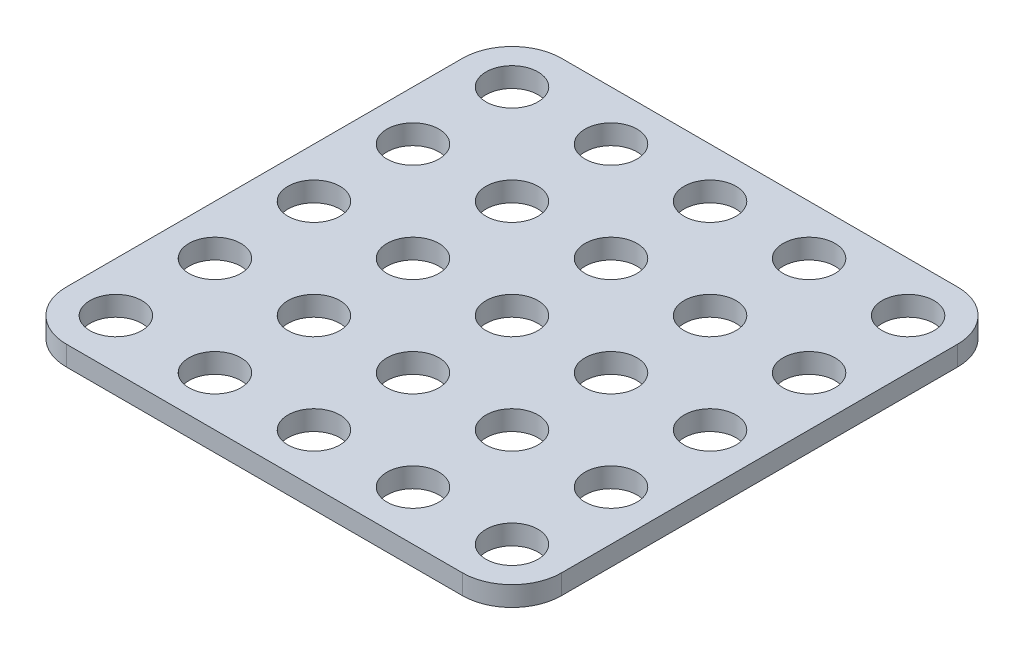
ISO-10303-21;
HEADER;
FILE_DESCRIPTION(('STEP AP214'),'2;1');
FILE_NAME('part.step','',(''),(''),'','','');
FILE_SCHEMA(('AUTOMOTIVE_DESIGN { 1 0 10303 214 1 1 1 1 }'));
ENDSEC;
DATA;
#1=APPLICATION_CONTEXT('core data for automotive mechanical design processes');
#2=APPLICATION_PROTOCOL_DEFINITION('international standard','automotive_design',2000,#1);
#3=PRODUCT_CONTEXT('',#1,'mechanical');
#4=PRODUCT('Part','Part','',(#3));
#5=PRODUCT_RELATED_PRODUCT_CATEGORY('part','',(#4));
#6=PRODUCT_DEFINITION_FORMATION('','',#4);
#7=PRODUCT_DEFINITION_CONTEXT('part definition',#1,'design');
#8=PRODUCT_DEFINITION('design','',#6,#7);
#9=PRODUCT_DEFINITION_SHAPE('','',#8);
#10=(LENGTH_UNIT() NAMED_UNIT(*) SI_UNIT(.MILLI.,.METRE.));
#11=(NAMED_UNIT(*) PLANE_ANGLE_UNIT() SI_UNIT($,.RADIAN.));
#12=(NAMED_UNIT(*) SI_UNIT($,.STERADIAN.) SOLID_ANGLE_UNIT());
#13=UNCERTAINTY_MEASURE_WITH_UNIT(LENGTH_MEASURE(1.E-05),#10,'distance_accuracy_value','');
#14=(GEOMETRIC_REPRESENTATION_CONTEXT(3) GLOBAL_UNCERTAINTY_ASSIGNED_CONTEXT((#13)) GLOBAL_UNIT_ASSIGNED_CONTEXT((#10,
#11,#12)) REPRESENTATION_CONTEXT('',''));
#15=CARTESIAN_POINT('',(0.,0.,0.));
#16=DIRECTION('',(0.,0.,1.));
#17=DIRECTION('',(1.,0.,0.));
#18=AXIS2_PLACEMENT_3D('',#15,#16,#17);
#19=CARTESIAN_POINT('',(0.,-1.6,-41.6));
#20=DIRECTION('',(0.,1.,0.));
#21=DIRECTION('',(0.,0.,1.));
#22=AXIS2_PLACEMENT_3D('',#19,#20,#21);
#23=PLANE('',#22);
#24=CARTESIAN_POINT('',(-28.8,-1.6,-4.8));
#25=DIRECTION('',(0.,1.,0.));
#26=DIRECTION('',(0.,0.,1.));
#27=AXIS2_PLACEMENT_3D('',#24,#25,#26);
#28=CIRCLE('',#27,2.09999999999999);
#29=CARTESIAN_POINT('',(-28.8,-1.6,-2.70000000000001));
#30=VERTEX_POINT('',#29);
#31=EDGE_CURVE('E111',#30,#30,#28,.T.);
#32=ORIENTED_EDGE('',*,*,#31,.T.);
#33=EDGE_LOOP('',(#32));
#34=FACE_BOUND('',#33,.T.);
#35=CARTESIAN_POINT('',(-36.8,-1.6,-4.79999999999999));
#36=DIRECTION('',(0.,1.,0.));
#37=DIRECTION('',(0.,0.,1.));
#38=AXIS2_PLACEMENT_3D('',#35,#36,#37);
#39=CIRCLE('',#38,2.09999999999999);
#40=CARTESIAN_POINT('',(-36.8,-1.6,-2.7));
#41=VERTEX_POINT('',#40);
#42=EDGE_CURVE('E214',#41,#41,#39,.T.);
#43=ORIENTED_EDGE('',*,*,#42,.T.);
#44=EDGE_LOOP('',(#43));
#45=FACE_BOUND('',#44,.T.);
#46=DIRECTION('',(1.,0.,0.));
#47=VECTOR('',#46,1.);
#48=CARTESIAN_POINT('',(-41.6,-1.6,-40.8));
#49=LINE('',#48,#47);
#50=CARTESIAN_POINT('',(-36.8,-1.6,-40.8));
#51=VERTEX_POINT('',#50);
#52=CARTESIAN_POINT('',(-4.8,-1.6,-40.8));
#53=VERTEX_POINT('',#52);
#54=EDGE_CURVE('E82',#51,#53,#49,.T.);
#55=ORIENTED_EDGE('',*,*,#54,.T.);
#56=CARTESIAN_POINT('',(-4.8,-1.6,-36.8));
#57=DIRECTION('',(0.,1.,0.));
#58=DIRECTION('',(0.,0.,1.));
#59=AXIS2_PLACEMENT_3D('',#56,#57,#58);
#60=CIRCLE('',#59,4.);
#61=CARTESIAN_POINT('',(-0.800000000000001,-1.6,-36.8));
#62=VERTEX_POINT('',#61);
#63=EDGE_CURVE('E85',#62,#53,#60,.T.);
#64=ORIENTED_EDGE('',*,*,#63,.F.);
#65=DIRECTION('',(0.,0.,1.));
#66=VECTOR('',#65,1.);
#67=CARTESIAN_POINT('',(-0.8,-1.6,-40.8));
#68=LINE('',#67,#66);
#69=CARTESIAN_POINT('',(-0.799999999999994,-1.6,-4.80000000000001));
#70=VERTEX_POINT('',#69);
#71=EDGE_CURVE('E77',#62,#70,#68,.T.);
#72=ORIENTED_EDGE('',*,*,#71,.T.);
#73=CARTESIAN_POINT('',(-4.79999999999999,-1.6,-4.80000000000001));
#74=DIRECTION('',(0.,1.,0.));
#75=DIRECTION('',(0.,0.,1.));
#76=AXIS2_PLACEMENT_3D('',#73,#74,#75);
#77=CIRCLE('',#76,4.);
#78=CARTESIAN_POINT('',(-4.79999999999999,-1.6,-0.800000000000005));
#79=VERTEX_POINT('',#78);
#80=EDGE_CURVE('E205',#79,#70,#77,.T.);
#81=ORIENTED_EDGE('',*,*,#80,.F.);
#82=DIRECTION('',(-1.,0.,0.));
#83=VECTOR('',#82,1.);
#84=CARTESIAN_POINT('',(-41.6,-1.6,-0.8));
#85=LINE('',#84,#83);
#86=CARTESIAN_POINT('',(-36.8,-1.6,-0.8));
#87=VERTEX_POINT('',#86);
#88=EDGE_CURVE('E112',#79,#87,#85,.T.);
#89=ORIENTED_EDGE('',*,*,#88,.T.);
#90=CARTESIAN_POINT('',(-36.8,-1.6,-4.8));
#91=DIRECTION('',(0.,-1.,0.));
#92=DIRECTION('',(0.,0.,-1.));
#93=AXIS2_PLACEMENT_3D('',#90,#91,#92);
#94=CIRCLE('',#93,4.);
#95=CARTESIAN_POINT('',(-40.8,-1.6,-4.8));
#96=VERTEX_POINT('',#95);
#97=EDGE_CURVE('E208',#96,#87,#94,.F.);
#98=ORIENTED_EDGE('',*,*,#97,.F.);
#99=DIRECTION('',(0.,0.,-1.));
#100=VECTOR('',#99,1.);
#101=CARTESIAN_POINT('',(-40.8,-1.6,-40.8));
#102=LINE('',#101,#100);
#103=CARTESIAN_POINT('',(-40.8,-1.6,-36.8));
#104=VERTEX_POINT('',#103);
#105=EDGE_CURVE('E116',#96,#104,#102,.T.);
#106=ORIENTED_EDGE('',*,*,#105,.T.);
#107=CARTESIAN_POINT('',(-36.8,-1.6,-36.8));
#108=DIRECTION('',(0.,1.,0.));
#109=DIRECTION('',(0.,0.,1.));
#110=AXIS2_PLACEMENT_3D('',#107,#108,#109);
#111=CIRCLE('',#110,4.);
#112=EDGE_CURVE('E88',#51,#104,#111,.T.);
#113=ORIENTED_EDGE('',*,*,#112,.F.);
#114=EDGE_LOOP('',(#55,#64,#72,#81,#89,#98,#106,#113));
#115=FACE_BOUND('',#114,.T.);
#116=CARTESIAN_POINT('',(-20.8,-1.6,-4.8));
#117=DIRECTION('',(0.,1.,0.));
#118=DIRECTION('',(0.,0.,1.));
#119=AXIS2_PLACEMENT_3D('',#116,#117,#118);
#120=CIRCLE('',#119,2.09999999999999);
#121=CARTESIAN_POINT('',(-20.8,-1.6,-2.70000000000001));
#122=VERTEX_POINT('',#121);
#123=EDGE_CURVE('E217',#122,#122,#120,.T.);
#124=ORIENTED_EDGE('',*,*,#123,.T.);
#125=EDGE_LOOP('',(#124));
#126=FACE_BOUND('',#125,.T.);
#127=CARTESIAN_POINT('',(-12.8,-1.6,-4.8));
#128=DIRECTION('',(0.,1.,0.));
#129=DIRECTION('',(0.,0.,1.));
#130=AXIS2_PLACEMENT_3D('',#127,#128,#129);
#131=CIRCLE('',#130,2.09999999999999);
#132=CARTESIAN_POINT('',(-12.8,-1.6,-2.70000000000001));
#133=VERTEX_POINT('',#132);
#134=EDGE_CURVE('E220',#133,#133,#131,.T.);
#135=ORIENTED_EDGE('',*,*,#134,.T.);
#136=EDGE_LOOP('',(#135));
#137=FACE_BOUND('',#136,.T.);
#138=CARTESIAN_POINT('',(-4.8,-1.6,-4.8));
#139=DIRECTION('',(0.,1.,0.));
#140=DIRECTION('',(0.,0.,1.));
#141=AXIS2_PLACEMENT_3D('',#138,#139,#140);
#142=CIRCLE('',#141,2.09999999999999);
#143=CARTESIAN_POINT('',(-4.8,-1.6,-2.70000000000001));
#144=VERTEX_POINT('',#143);
#145=EDGE_CURVE('E223',#144,#144,#142,.T.);
#146=ORIENTED_EDGE('',*,*,#145,.T.);
#147=EDGE_LOOP('',(#146));
#148=FACE_BOUND('',#147,.T.);
#149=CARTESIAN_POINT('',(-36.8,-1.6,-12.8));
#150=DIRECTION('',(0.,1.,0.));
#151=DIRECTION('',(0.,0.,1.));
#152=AXIS2_PLACEMENT_3D('',#149,#150,#151);
#153=CIRCLE('',#152,2.09999999999999);
#154=CARTESIAN_POINT('',(-36.8,-1.6,-10.7));
#155=VERTEX_POINT('',#154);
#156=EDGE_CURVE('E226',#155,#155,#153,.T.);
#157=ORIENTED_EDGE('',*,*,#156,.T.);
#158=EDGE_LOOP('',(#157));
#159=FACE_BOUND('',#158,.T.);
#160=CARTESIAN_POINT('',(-28.8,-1.6,-12.8));
#161=DIRECTION('',(0.,1.,0.));
#162=DIRECTION('',(0.,0.,1.));
#163=AXIS2_PLACEMENT_3D('',#160,#161,#162);
#164=CIRCLE('',#163,2.09999999999999);
#165=CARTESIAN_POINT('',(-28.8,-1.6,-10.7));
#166=VERTEX_POINT('',#165);
#167=EDGE_CURVE('E229',#166,#166,#164,.T.);
#168=ORIENTED_EDGE('',*,*,#167,.T.);
#169=EDGE_LOOP('',(#168));
#170=FACE_BOUND('',#169,.T.);
#171=CARTESIAN_POINT('',(-20.8,-1.6,-12.8));
#172=DIRECTION('',(0.,1.,0.));
#173=DIRECTION('',(0.,0.,1.));
#174=AXIS2_PLACEMENT_3D('',#171,#172,#173);
#175=CIRCLE('',#174,2.09999999999999);
#176=CARTESIAN_POINT('',(-20.8,-1.6,-10.7));
#177=VERTEX_POINT('',#176);
#178=EDGE_CURVE('E232',#177,#177,#175,.T.);
#179=ORIENTED_EDGE('',*,*,#178,.T.);
#180=EDGE_LOOP('',(#179));
#181=FACE_BOUND('',#180,.T.);
#182=CARTESIAN_POINT('',(-12.8,-1.6,-12.8));
#183=DIRECTION('',(0.,1.,0.));
#184=DIRECTION('',(0.,0.,1.));
#185=AXIS2_PLACEMENT_3D('',#182,#183,#184);
#186=CIRCLE('',#185,2.09999999999999);
#187=CARTESIAN_POINT('',(-12.8,-1.6,-10.7));
#188=VERTEX_POINT('',#187);
#189=EDGE_CURVE('E235',#188,#188,#186,.T.);
#190=ORIENTED_EDGE('',*,*,#189,.T.);
#191=EDGE_LOOP('',(#190));
#192=FACE_BOUND('',#191,.T.);
#193=CARTESIAN_POINT('',(-4.8,-1.6,-12.8));
#194=DIRECTION('',(0.,1.,0.));
#195=DIRECTION('',(0.,0.,1.));
#196=AXIS2_PLACEMENT_3D('',#193,#194,#195);
#197=CIRCLE('',#196,2.09999999999999);
#198=CARTESIAN_POINT('',(-4.8,-1.6,-10.7));
#199=VERTEX_POINT('',#198);
#200=EDGE_CURVE('E238',#199,#199,#197,.T.);
#201=ORIENTED_EDGE('',*,*,#200,.T.);
#202=EDGE_LOOP('',(#201));
#203=FACE_BOUND('',#202,.T.);
#204=CARTESIAN_POINT('',(-36.8,-1.6,-20.8));
#205=DIRECTION('',(0.,1.,0.));
#206=DIRECTION('',(0.,0.,1.));
#207=AXIS2_PLACEMENT_3D('',#204,#205,#206);
#208=CIRCLE('',#207,2.09999999999999);
#209=CARTESIAN_POINT('',(-36.8,-1.6,-18.7));
#210=VERTEX_POINT('',#209);
#211=EDGE_CURVE('E241',#210,#210,#208,.T.);
#212=ORIENTED_EDGE('',*,*,#211,.T.);
#213=EDGE_LOOP('',(#212));
#214=FACE_BOUND('',#213,.T.);
#215=CARTESIAN_POINT('',(-28.8,-1.6,-20.8));
#216=DIRECTION('',(0.,1.,0.));
#217=DIRECTION('',(0.,0.,1.));
#218=AXIS2_PLACEMENT_3D('',#215,#216,#217);
#219=CIRCLE('',#218,2.09999999999999);
#220=CARTESIAN_POINT('',(-28.8,-1.6,-18.7));
#221=VERTEX_POINT('',#220);
#222=EDGE_CURVE('E244',#221,#221,#219,.T.);
#223=ORIENTED_EDGE('',*,*,#222,.T.);
#224=EDGE_LOOP('',(#223));
#225=FACE_BOUND('',#224,.T.);
#226=CARTESIAN_POINT('',(-20.8,-1.6,-20.8));
#227=DIRECTION('',(0.,1.,0.));
#228=DIRECTION('',(0.,0.,1.));
#229=AXIS2_PLACEMENT_3D('',#226,#227,#228);
#230=CIRCLE('',#229,2.09999999999999);
#231=CARTESIAN_POINT('',(-20.8,-1.6,-18.7));
#232=VERTEX_POINT('',#231);
#233=EDGE_CURVE('E247',#232,#232,#230,.T.);
#234=ORIENTED_EDGE('',*,*,#233,.T.);
#235=EDGE_LOOP('',(#234));
#236=FACE_BOUND('',#235,.T.);
#237=CARTESIAN_POINT('',(-12.8,-1.6,-20.8));
#238=DIRECTION('',(0.,1.,0.));
#239=DIRECTION('',(0.,0.,1.));
#240=AXIS2_PLACEMENT_3D('',#237,#238,#239);
#241=CIRCLE('',#240,2.09999999999999);
#242=CARTESIAN_POINT('',(-12.8,-1.6,-18.7));
#243=VERTEX_POINT('',#242);
#244=EDGE_CURVE('E250',#243,#243,#241,.T.);
#245=ORIENTED_EDGE('',*,*,#244,.T.);
#246=EDGE_LOOP('',(#245));
#247=FACE_BOUND('',#246,.T.);
#248=CARTESIAN_POINT('',(-4.8,-1.6,-20.8));
#249=DIRECTION('',(0.,1.,0.));
#250=DIRECTION('',(0.,0.,1.));
#251=AXIS2_PLACEMENT_3D('',#248,#249,#250);
#252=CIRCLE('',#251,2.09999999999999);
#253=CARTESIAN_POINT('',(-4.8,-1.6,-18.7));
#254=VERTEX_POINT('',#253);
#255=EDGE_CURVE('E253',#254,#254,#252,.T.);
#256=ORIENTED_EDGE('',*,*,#255,.T.);
#257=EDGE_LOOP('',(#256));
#258=FACE_BOUND('',#257,.T.);
#259=CARTESIAN_POINT('',(-36.8,-1.6,-28.8));
#260=DIRECTION('',(0.,1.,0.));
#261=DIRECTION('',(0.,0.,1.));
#262=AXIS2_PLACEMENT_3D('',#259,#260,#261);
#263=CIRCLE('',#262,2.09999999999999);
#264=CARTESIAN_POINT('',(-36.8,-1.6,-26.7));
#265=VERTEX_POINT('',#264);
#266=EDGE_CURVE('E256',#265,#265,#263,.T.);
#267=ORIENTED_EDGE('',*,*,#266,.T.);
#268=EDGE_LOOP('',(#267));
#269=FACE_BOUND('',#268,.T.);
#270=CARTESIAN_POINT('',(-28.8,-1.6,-28.8));
#271=DIRECTION('',(0.,1.,0.));
#272=DIRECTION('',(0.,0.,1.));
#273=AXIS2_PLACEMENT_3D('',#270,#271,#272);
#274=CIRCLE('',#273,2.09999999999999);
#275=CARTESIAN_POINT('',(-28.8,-1.6,-26.7));
#276=VERTEX_POINT('',#275);
#277=EDGE_CURVE('E259',#276,#276,#274,.T.);
#278=ORIENTED_EDGE('',*,*,#277,.T.);
#279=EDGE_LOOP('',(#278));
#280=FACE_BOUND('',#279,.T.);
#281=CARTESIAN_POINT('',(-20.8,-1.6,-28.8));
#282=DIRECTION('',(0.,1.,0.));
#283=DIRECTION('',(0.,0.,1.));
#284=AXIS2_PLACEMENT_3D('',#281,#282,#283);
#285=CIRCLE('',#284,2.09999999999999);
#286=CARTESIAN_POINT('',(-20.8,-1.6,-26.7));
#287=VERTEX_POINT('',#286);
#288=EDGE_CURVE('E262',#287,#287,#285,.T.);
#289=ORIENTED_EDGE('',*,*,#288,.T.);
#290=EDGE_LOOP('',(#289));
#291=FACE_BOUND('',#290,.T.);
#292=CARTESIAN_POINT('',(-12.8,-1.6,-28.8));
#293=DIRECTION('',(0.,1.,0.));
#294=DIRECTION('',(0.,0.,1.));
#295=AXIS2_PLACEMENT_3D('',#292,#293,#294);
#296=CIRCLE('',#295,2.09999999999999);
#297=CARTESIAN_POINT('',(-12.8,-1.6,-26.7));
#298=VERTEX_POINT('',#297);
#299=EDGE_CURVE('E265',#298,#298,#296,.T.);
#300=ORIENTED_EDGE('',*,*,#299,.T.);
#301=EDGE_LOOP('',(#300));
#302=FACE_BOUND('',#301,.T.);
#303=CARTESIAN_POINT('',(-4.8,-1.6,-28.8));
#304=DIRECTION('',(0.,1.,0.));
#305=DIRECTION('',(0.,0.,1.));
#306=AXIS2_PLACEMENT_3D('',#303,#304,#305);
#307=CIRCLE('',#306,2.09999999999999);
#308=CARTESIAN_POINT('',(-4.8,-1.6,-26.7));
#309=VERTEX_POINT('',#308);
#310=EDGE_CURVE('E268',#309,#309,#307,.T.);
#311=ORIENTED_EDGE('',*,*,#310,.T.);
#312=EDGE_LOOP('',(#311));
#313=FACE_BOUND('',#312,.T.);
#314=CARTESIAN_POINT('',(-36.8,-1.6,-36.8));
#315=DIRECTION('',(0.,1.,0.));
#316=DIRECTION('',(0.,0.,1.));
#317=AXIS2_PLACEMENT_3D('',#314,#315,#316);
#318=CIRCLE('',#317,2.09999999999999);
#319=CARTESIAN_POINT('',(-36.8,-1.6,-34.7));
#320=VERTEX_POINT('',#319);
#321=EDGE_CURVE('E271',#320,#320,#318,.T.);
#322=ORIENTED_EDGE('',*,*,#321,.T.);
#323=EDGE_LOOP('',(#322));
#324=FACE_BOUND('',#323,.T.);
#325=CARTESIAN_POINT('',(-28.8,-1.6,-36.8));
#326=DIRECTION('',(0.,1.,0.));
#327=DIRECTION('',(0.,0.,1.));
#328=AXIS2_PLACEMENT_3D('',#325,#326,#327);
#329=CIRCLE('',#328,2.09999999999999);
#330=CARTESIAN_POINT('',(-28.8,-1.6,-34.7));
#331=VERTEX_POINT('',#330);
#332=EDGE_CURVE('E274',#331,#331,#329,.T.);
#333=ORIENTED_EDGE('',*,*,#332,.T.);
#334=EDGE_LOOP('',(#333));
#335=FACE_BOUND('',#334,.T.);
#336=CARTESIAN_POINT('',(-20.8,-1.6,-36.8));
#337=DIRECTION('',(0.,1.,0.));
#338=DIRECTION('',(0.,0.,1.));
#339=AXIS2_PLACEMENT_3D('',#336,#337,#338);
#340=CIRCLE('',#339,2.09999999999999);
#341=CARTESIAN_POINT('',(-20.8,-1.6,-34.7));
#342=VERTEX_POINT('',#341);
#343=EDGE_CURVE('E277',#342,#342,#340,.T.);
#344=ORIENTED_EDGE('',*,*,#343,.T.);
#345=EDGE_LOOP('',(#344));
#346=FACE_BOUND('',#345,.T.);
#347=CARTESIAN_POINT('',(-12.8,-1.6,-36.8));
#348=DIRECTION('',(0.,1.,0.));
#349=DIRECTION('',(0.,0.,1.));
#350=AXIS2_PLACEMENT_3D('',#347,#348,#349);
#351=CIRCLE('',#350,2.09999999999999);
#352=CARTESIAN_POINT('',(-12.8,-1.6,-34.7));
#353=VERTEX_POINT('',#352);
#354=EDGE_CURVE('E279',#353,#353,#351,.T.);
#355=ORIENTED_EDGE('',*,*,#354,.T.);
#356=EDGE_LOOP('',(#355));
#357=FACE_BOUND('',#356,.T.);
#358=CARTESIAN_POINT('',(-4.8,-1.6,-36.8));
#359=DIRECTION('',(0.,1.,0.));
#360=DIRECTION('',(0.,0.,1.));
#361=AXIS2_PLACEMENT_3D('',#358,#359,#360);
#362=CIRCLE('',#361,2.09999999999999);
#363=CARTESIAN_POINT('',(-4.8,-1.6,-34.7));
#364=VERTEX_POINT('',#363);
#365=EDGE_CURVE('E19',#364,#364,#362,.T.);
#366=ORIENTED_EDGE('',*,*,#365,.T.);
#367=EDGE_LOOP('',(#366));
#368=FACE_BOUND('',#367,.T.);
#369=ADVANCED_FACE('F16',(#34,#45,#115,#126,#137,#148,#159,#170,#181,#192,#203,#214,#225,#236,
#247,#258,#269,#280,#291,#302,#313,#324,#335,#346,#357,#368),#23,.F.);
#370=CARTESIAN_POINT('',(-4.8,-10.,-36.8));
#371=DIRECTION('',(0.,1.,0.));
#372=DIRECTION('',(0.,0.,1.));
#373=AXIS2_PLACEMENT_3D('',#370,#371,#372);
#374=CYLINDRICAL_SURFACE('',#373,2.09999999999999);
#375=ORIENTED_EDGE('',*,*,#365,.F.);
#376=EDGE_LOOP('',(#375));
#377=FACE_BOUND('',#376,.T.);
#378=CARTESIAN_POINT('',(-4.8,0.,-36.8));
#379=DIRECTION('',(0.,1.,0.));
#380=DIRECTION('',(0.,0.,1.));
#381=AXIS2_PLACEMENT_3D('',#378,#379,#380);
#382=CIRCLE('',#381,2.09999999999999);
#383=CARTESIAN_POINT('',(-4.8,0.,-34.7));
#384=VERTEX_POINT('',#383);
#385=EDGE_CURVE('E201',#384,#384,#382,.F.);
#386=ORIENTED_EDGE('',*,*,#385,.F.);
#387=EDGE_LOOP('',(#386));
#388=FACE_BOUND('',#387,.T.);
#389=ADVANCED_FACE('F287',(#377,#388),#374,.F.);
#390=CARTESIAN_POINT('',(-12.8,-10.,-36.8));
#391=DIRECTION('',(0.,1.,0.));
#392=DIRECTION('',(0.,0.,1.));
#393=AXIS2_PLACEMENT_3D('',#390,#391,#392);
#394=CYLINDRICAL_SURFACE('',#393,2.09999999999999);
#395=ORIENTED_EDGE('',*,*,#354,.F.);
#396=EDGE_LOOP('',(#395));
#397=FACE_BOUND('',#396,.T.);
#398=CARTESIAN_POINT('',(-12.8,0.,-36.8));
#399=DIRECTION('',(0.,1.,0.));
#400=DIRECTION('',(0.,0.,1.));
#401=AXIS2_PLACEMENT_3D('',#398,#399,#400);
#402=CIRCLE('',#401,2.09999999999999);
#403=CARTESIAN_POINT('',(-12.8,0.,-34.7));
#404=VERTEX_POINT('',#403);
#405=EDGE_CURVE('E198',#404,#404,#402,.F.);
#406=ORIENTED_EDGE('',*,*,#405,.F.);
#407=EDGE_LOOP('',(#406));
#408=FACE_BOUND('',#407,.T.);
#409=ADVANCED_FACE('F290',(#397,#408),#394,.F.);
#410=CARTESIAN_POINT('',(-20.8,-10.,-36.8));
#411=DIRECTION('',(0.,1.,0.));
#412=DIRECTION('',(0.,0.,1.));
#413=AXIS2_PLACEMENT_3D('',#410,#411,#412);
#414=CYLINDRICAL_SURFACE('',#413,2.09999999999999);
#415=ORIENTED_EDGE('',*,*,#343,.F.);
#416=EDGE_LOOP('',(#415));
#417=FACE_BOUND('',#416,.T.);
#418=CARTESIAN_POINT('',(-20.8,0.,-36.8));
#419=DIRECTION('',(0.,1.,0.));
#420=DIRECTION('',(0.,0.,1.));
#421=AXIS2_PLACEMENT_3D('',#418,#419,#420);
#422=CIRCLE('',#421,2.09999999999999);
#423=CARTESIAN_POINT('',(-20.8,0.,-34.7));
#424=VERTEX_POINT('',#423);
#425=EDGE_CURVE('E195',#424,#424,#422,.F.);
#426=ORIENTED_EDGE('',*,*,#425,.F.);
#427=EDGE_LOOP('',(#426));
#428=FACE_BOUND('',#427,.T.);
#429=ADVANCED_FACE('F416',(#417,#428),#414,.F.);
#430=CARTESIAN_POINT('',(-28.8,-10.,-36.8));
#431=DIRECTION('',(0.,1.,0.));
#432=DIRECTION('',(0.,0.,1.));
#433=AXIS2_PLACEMENT_3D('',#430,#431,#432);
#434=CYLINDRICAL_SURFACE('',#433,2.09999999999999);
#435=ORIENTED_EDGE('',*,*,#332,.F.);
#436=EDGE_LOOP('',(#435));
#437=FACE_BOUND('',#436,.T.);
#438=CARTESIAN_POINT('',(-28.8,0.,-36.8));
#439=DIRECTION('',(0.,1.,0.));
#440=DIRECTION('',(0.,0.,1.));
#441=AXIS2_PLACEMENT_3D('',#438,#439,#440);
#442=CIRCLE('',#441,2.09999999999999);
#443=CARTESIAN_POINT('',(-28.8,0.,-34.7));
#444=VERTEX_POINT('',#443);
#445=EDGE_CURVE('E192',#444,#444,#442,.F.);
#446=ORIENTED_EDGE('',*,*,#445,.F.);
#447=EDGE_LOOP('',(#446));
#448=FACE_BOUND('',#447,.T.);
#449=ADVANCED_FACE('F412',(#437,#448),#434,.F.);
#450=CARTESIAN_POINT('',(-36.8,-10.,-36.8));
#451=DIRECTION('',(0.,1.,0.));
#452=DIRECTION('',(0.,0.,1.));
#453=AXIS2_PLACEMENT_3D('',#450,#451,#452);
#454=CYLINDRICAL_SURFACE('',#453,2.09999999999999);
#455=ORIENTED_EDGE('',*,*,#321,.F.);
#456=EDGE_LOOP('',(#455));
#457=FACE_BOUND('',#456,.T.);
#458=CARTESIAN_POINT('',(-36.8,0.,-36.8));
#459=DIRECTION('',(0.,1.,0.));
#460=DIRECTION('',(0.,0.,1.));
#461=AXIS2_PLACEMENT_3D('',#458,#459,#460);
#462=CIRCLE('',#461,2.09999999999999);
#463=CARTESIAN_POINT('',(-36.8,0.,-34.7));
#464=VERTEX_POINT('',#463);
#465=EDGE_CURVE('E189',#464,#464,#462,.F.);
#466=ORIENTED_EDGE('',*,*,#465,.F.);
#467=EDGE_LOOP('',(#466));
#468=FACE_BOUND('',#467,.T.);
#469=ADVANCED_FACE('F408',(#457,#468),#454,.F.);
#470=CARTESIAN_POINT('',(-4.8,-10.,-28.8));
#471=DIRECTION('',(0.,1.,0.));
#472=DIRECTION('',(0.,0.,1.));
#473=AXIS2_PLACEMENT_3D('',#470,#471,#472);
#474=CYLINDRICAL_SURFACE('',#473,2.09999999999999);
#475=ORIENTED_EDGE('',*,*,#310,.F.);
#476=EDGE_LOOP('',(#475));
#477=FACE_BOUND('',#476,.T.);
#478=CARTESIAN_POINT('',(-4.8,0.,-28.8));
#479=DIRECTION('',(0.,1.,0.));
#480=DIRECTION('',(0.,0.,1.));
#481=AXIS2_PLACEMENT_3D('',#478,#479,#480);
#482=CIRCLE('',#481,2.09999999999999);
#483=CARTESIAN_POINT('',(-4.8,0.,-26.7));
#484=VERTEX_POINT('',#483);
#485=EDGE_CURVE('E186',#484,#484,#482,.F.);
#486=ORIENTED_EDGE('',*,*,#485,.F.);
#487=EDGE_LOOP('',(#486));
#488=FACE_BOUND('',#487,.T.);
#489=ADVANCED_FACE('F404',(#477,#488),#474,.F.);
#490=CARTESIAN_POINT('',(-12.8,-10.,-28.8));
#491=DIRECTION('',(0.,1.,0.));
#492=DIRECTION('',(0.,0.,1.));
#493=AXIS2_PLACEMENT_3D('',#490,#491,#492);
#494=CYLINDRICAL_SURFACE('',#493,2.09999999999999);
#495=ORIENTED_EDGE('',*,*,#299,.F.);
#496=EDGE_LOOP('',(#495));
#497=FACE_BOUND('',#496,.T.);
#498=CARTESIAN_POINT('',(-12.8,0.,-28.8));
#499=DIRECTION('',(0.,1.,0.));
#500=DIRECTION('',(0.,0.,1.));
#501=AXIS2_PLACEMENT_3D('',#498,#499,#500);
#502=CIRCLE('',#501,2.09999999999999);
#503=CARTESIAN_POINT('',(-12.8,0.,-26.7));
#504=VERTEX_POINT('',#503);
#505=EDGE_CURVE('E183',#504,#504,#502,.F.);
#506=ORIENTED_EDGE('',*,*,#505,.F.);
#507=EDGE_LOOP('',(#506));
#508=FACE_BOUND('',#507,.T.);
#509=ADVANCED_FACE('F400',(#497,#508),#494,.F.);
#510=CARTESIAN_POINT('',(-20.8,-10.,-28.8));
#511=DIRECTION('',(0.,1.,0.));
#512=DIRECTION('',(0.,0.,1.));
#513=AXIS2_PLACEMENT_3D('',#510,#511,#512);
#514=CYLINDRICAL_SURFACE('',#513,2.09999999999999);
#515=ORIENTED_EDGE('',*,*,#288,.F.);
#516=EDGE_LOOP('',(#515));
#517=FACE_BOUND('',#516,.T.);
#518=CARTESIAN_POINT('',(-20.8,0.,-28.8));
#519=DIRECTION('',(0.,1.,0.));
#520=DIRECTION('',(0.,0.,1.));
#521=AXIS2_PLACEMENT_3D('',#518,#519,#520);
#522=CIRCLE('',#521,2.09999999999999);
#523=CARTESIAN_POINT('',(-20.8,0.,-26.7));
#524=VERTEX_POINT('',#523);
#525=EDGE_CURVE('E180',#524,#524,#522,.F.);
#526=ORIENTED_EDGE('',*,*,#525,.F.);
#527=EDGE_LOOP('',(#526));
#528=FACE_BOUND('',#527,.T.);
#529=ADVANCED_FACE('F396',(#517,#528),#514,.F.);
#530=CARTESIAN_POINT('',(-28.8,-10.,-28.8));
#531=DIRECTION('',(0.,1.,0.));
#532=DIRECTION('',(0.,0.,1.));
#533=AXIS2_PLACEMENT_3D('',#530,#531,#532);
#534=CYLINDRICAL_SURFACE('',#533,2.09999999999999);
#535=ORIENTED_EDGE('',*,*,#277,.F.);
#536=EDGE_LOOP('',(#535));
#537=FACE_BOUND('',#536,.T.);
#538=CARTESIAN_POINT('',(-28.8,0.,-28.8));
#539=DIRECTION('',(0.,1.,0.));
#540=DIRECTION('',(0.,0.,1.));
#541=AXIS2_PLACEMENT_3D('',#538,#539,#540);
#542=CIRCLE('',#541,2.09999999999999);
#543=CARTESIAN_POINT('',(-28.8,0.,-26.7));
#544=VERTEX_POINT('',#543);
#545=EDGE_CURVE('E177',#544,#544,#542,.F.);
#546=ORIENTED_EDGE('',*,*,#545,.F.);
#547=EDGE_LOOP('',(#546));
#548=FACE_BOUND('',#547,.T.);
#549=ADVANCED_FACE('F392',(#537,#548),#534,.F.);
#550=CARTESIAN_POINT('',(-36.8,-10.,-28.8));
#551=DIRECTION('',(0.,1.,0.));
#552=DIRECTION('',(0.,0.,1.));
#553=AXIS2_PLACEMENT_3D('',#550,#551,#552);
#554=CYLINDRICAL_SURFACE('',#553,2.09999999999999);
#555=ORIENTED_EDGE('',*,*,#266,.F.);
#556=EDGE_LOOP('',(#555));
#557=FACE_BOUND('',#556,.T.);
#558=CARTESIAN_POINT('',(-36.8,0.,-28.8));
#559=DIRECTION('',(0.,1.,0.));
#560=DIRECTION('',(0.,0.,1.));
#561=AXIS2_PLACEMENT_3D('',#558,#559,#560);
#562=CIRCLE('',#561,2.09999999999999);
#563=CARTESIAN_POINT('',(-36.8,0.,-26.7));
#564=VERTEX_POINT('',#563);
#565=EDGE_CURVE('E174',#564,#564,#562,.F.);
#566=ORIENTED_EDGE('',*,*,#565,.F.);
#567=EDGE_LOOP('',(#566));
#568=FACE_BOUND('',#567,.T.);
#569=ADVANCED_FACE('F388',(#557,#568),#554,.F.);
#570=CARTESIAN_POINT('',(-4.8,-10.,-20.8));
#571=DIRECTION('',(0.,1.,0.));
#572=DIRECTION('',(0.,0.,1.));
#573=AXIS2_PLACEMENT_3D('',#570,#571,#572);
#574=CYLINDRICAL_SURFACE('',#573,2.09999999999999);
#575=ORIENTED_EDGE('',*,*,#255,.F.);
#576=EDGE_LOOP('',(#575));
#577=FACE_BOUND('',#576,.T.);
#578=CARTESIAN_POINT('',(-4.8,0.,-20.8));
#579=DIRECTION('',(0.,1.,0.));
#580=DIRECTION('',(0.,0.,1.));
#581=AXIS2_PLACEMENT_3D('',#578,#579,#580);
#582=CIRCLE('',#581,2.09999999999999);
#583=CARTESIAN_POINT('',(-4.8,0.,-18.7));
#584=VERTEX_POINT('',#583);
#585=EDGE_CURVE('E171',#584,#584,#582,.F.);
#586=ORIENTED_EDGE('',*,*,#585,.F.);
#587=EDGE_LOOP('',(#586));
#588=FACE_BOUND('',#587,.T.);
#589=ADVANCED_FACE('F384',(#577,#588),#574,.F.);
#590=CARTESIAN_POINT('',(-12.8,-10.,-20.8));
#591=DIRECTION('',(0.,1.,0.));
#592=DIRECTION('',(0.,0.,1.));
#593=AXIS2_PLACEMENT_3D('',#590,#591,#592);
#594=CYLINDRICAL_SURFACE('',#593,2.09999999999999);
#595=ORIENTED_EDGE('',*,*,#244,.F.);
#596=EDGE_LOOP('',(#595));
#597=FACE_BOUND('',#596,.T.);
#598=CARTESIAN_POINT('',(-12.8,0.,-20.8));
#599=DIRECTION('',(0.,1.,0.));
#600=DIRECTION('',(0.,0.,1.));
#601=AXIS2_PLACEMENT_3D('',#598,#599,#600);
#602=CIRCLE('',#601,2.09999999999999);
#603=CARTESIAN_POINT('',(-12.8,0.,-18.7));
#604=VERTEX_POINT('',#603);
#605=EDGE_CURVE('E168',#604,#604,#602,.F.);
#606=ORIENTED_EDGE('',*,*,#605,.F.);
#607=EDGE_LOOP('',(#606));
#608=FACE_BOUND('',#607,.T.);
#609=ADVANCED_FACE('F380',(#597,#608),#594,.F.);
#610=CARTESIAN_POINT('',(-20.8,-10.,-20.8));
#611=DIRECTION('',(0.,1.,0.));
#612=DIRECTION('',(0.,0.,1.));
#613=AXIS2_PLACEMENT_3D('',#610,#611,#612);
#614=CYLINDRICAL_SURFACE('',#613,2.09999999999999);
#615=ORIENTED_EDGE('',*,*,#233,.F.);
#616=EDGE_LOOP('',(#615));
#617=FACE_BOUND('',#616,.T.);
#618=CARTESIAN_POINT('',(-20.8,0.,-20.8));
#619=DIRECTION('',(0.,1.,0.));
#620=DIRECTION('',(0.,0.,1.));
#621=AXIS2_PLACEMENT_3D('',#618,#619,#620);
#622=CIRCLE('',#621,2.09999999999999);
#623=CARTESIAN_POINT('',(-20.8,0.,-18.7));
#624=VERTEX_POINT('',#623);
#625=EDGE_CURVE('E165',#624,#624,#622,.F.);
#626=ORIENTED_EDGE('',*,*,#625,.F.);
#627=EDGE_LOOP('',(#626));
#628=FACE_BOUND('',#627,.T.);
#629=ADVANCED_FACE('F376',(#617,#628),#614,.F.);
#630=CARTESIAN_POINT('',(-28.8,-10.,-20.8));
#631=DIRECTION('',(0.,1.,0.));
#632=DIRECTION('',(0.,0.,1.));
#633=AXIS2_PLACEMENT_3D('',#630,#631,#632);
#634=CYLINDRICAL_SURFACE('',#633,2.09999999999999);
#635=ORIENTED_EDGE('',*,*,#222,.F.);
#636=EDGE_LOOP('',(#635));
#637=FACE_BOUND('',#636,.T.);
#638=CARTESIAN_POINT('',(-28.8,0.,-20.8));
#639=DIRECTION('',(0.,1.,0.));
#640=DIRECTION('',(0.,0.,1.));
#641=AXIS2_PLACEMENT_3D('',#638,#639,#640);
#642=CIRCLE('',#641,2.09999999999999);
#643=CARTESIAN_POINT('',(-28.8,0.,-18.7));
#644=VERTEX_POINT('',#643);
#645=EDGE_CURVE('E162',#644,#644,#642,.F.);
#646=ORIENTED_EDGE('',*,*,#645,.F.);
#647=EDGE_LOOP('',(#646));
#648=FACE_BOUND('',#647,.T.);
#649=ADVANCED_FACE('F372',(#637,#648),#634,.F.);
#650=CARTESIAN_POINT('',(-36.8,-10.,-20.8));
#651=DIRECTION('',(0.,1.,0.));
#652=DIRECTION('',(0.,0.,1.));
#653=AXIS2_PLACEMENT_3D('',#650,#651,#652);
#654=CYLINDRICAL_SURFACE('',#653,2.09999999999999);
#655=ORIENTED_EDGE('',*,*,#211,.F.);
#656=EDGE_LOOP('',(#655));
#657=FACE_BOUND('',#656,.T.);
#658=CARTESIAN_POINT('',(-36.8,0.,-20.8));
#659=DIRECTION('',(0.,1.,0.));
#660=DIRECTION('',(0.,0.,1.));
#661=AXIS2_PLACEMENT_3D('',#658,#659,#660);
#662=CIRCLE('',#661,2.09999999999999);
#663=CARTESIAN_POINT('',(-36.8,0.,-18.7));
#664=VERTEX_POINT('',#663);
#665=EDGE_CURVE('E159',#664,#664,#662,.F.);
#666=ORIENTED_EDGE('',*,*,#665,.F.);
#667=EDGE_LOOP('',(#666));
#668=FACE_BOUND('',#667,.T.);
#669=ADVANCED_FACE('F368',(#657,#668),#654,.F.);
#670=CARTESIAN_POINT('',(-4.8,-10.,-12.8));
#671=DIRECTION('',(0.,1.,0.));
#672=DIRECTION('',(0.,0.,1.));
#673=AXIS2_PLACEMENT_3D('',#670,#671,#672);
#674=CYLINDRICAL_SURFACE('',#673,2.09999999999999);
#675=ORIENTED_EDGE('',*,*,#200,.F.);
#676=EDGE_LOOP('',(#675));
#677=FACE_BOUND('',#676,.T.);
#678=CARTESIAN_POINT('',(-4.8,0.,-12.8));
#679=DIRECTION('',(0.,1.,0.));
#680=DIRECTION('',(0.,0.,1.));
#681=AXIS2_PLACEMENT_3D('',#678,#679,#680);
#682=CIRCLE('',#681,2.09999999999999);
#683=CARTESIAN_POINT('',(-4.8,0.,-10.7));
#684=VERTEX_POINT('',#683);
#685=EDGE_CURVE('E156',#684,#684,#682,.F.);
#686=ORIENTED_EDGE('',*,*,#685,.F.);
#687=EDGE_LOOP('',(#686));
#688=FACE_BOUND('',#687,.T.);
#689=ADVANCED_FACE('F364',(#677,#688),#674,.F.);
#690=CARTESIAN_POINT('',(-12.8,-10.,-12.8));
#691=DIRECTION('',(0.,1.,0.));
#692=DIRECTION('',(0.,0.,1.));
#693=AXIS2_PLACEMENT_3D('',#690,#691,#692);
#694=CYLINDRICAL_SURFACE('',#693,2.09999999999999);
#695=ORIENTED_EDGE('',*,*,#189,.F.);
#696=EDGE_LOOP('',(#695));
#697=FACE_BOUND('',#696,.T.);
#698=CARTESIAN_POINT('',(-12.8,0.,-12.8));
#699=DIRECTION('',(0.,1.,0.));
#700=DIRECTION('',(0.,0.,1.));
#701=AXIS2_PLACEMENT_3D('',#698,#699,#700);
#702=CIRCLE('',#701,2.09999999999999);
#703=CARTESIAN_POINT('',(-12.8,0.,-10.7));
#704=VERTEX_POINT('',#703);
#705=EDGE_CURVE('E153',#704,#704,#702,.F.);
#706=ORIENTED_EDGE('',*,*,#705,.F.);
#707=EDGE_LOOP('',(#706));
#708=FACE_BOUND('',#707,.T.);
#709=ADVANCED_FACE('F360',(#697,#708),#694,.F.);
#710=CARTESIAN_POINT('',(-20.8,-10.,-12.8));
#711=DIRECTION('',(0.,1.,0.));
#712=DIRECTION('',(0.,0.,1.));
#713=AXIS2_PLACEMENT_3D('',#710,#711,#712);
#714=CYLINDRICAL_SURFACE('',#713,2.09999999999999);
#715=ORIENTED_EDGE('',*,*,#178,.F.);
#716=EDGE_LOOP('',(#715));
#717=FACE_BOUND('',#716,.T.);
#718=CARTESIAN_POINT('',(-20.8,0.,-12.8));
#719=DIRECTION('',(0.,1.,0.));
#720=DIRECTION('',(0.,0.,1.));
#721=AXIS2_PLACEMENT_3D('',#718,#719,#720);
#722=CIRCLE('',#721,2.09999999999999);
#723=CARTESIAN_POINT('',(-20.8,0.,-10.7));
#724=VERTEX_POINT('',#723);
#725=EDGE_CURVE('E150',#724,#724,#722,.F.);
#726=ORIENTED_EDGE('',*,*,#725,.F.);
#727=EDGE_LOOP('',(#726));
#728=FACE_BOUND('',#727,.T.);
#729=ADVANCED_FACE('F356',(#717,#728),#714,.F.);
#730=CARTESIAN_POINT('',(-28.8,-10.,-12.8));
#731=DIRECTION('',(0.,1.,0.));
#732=DIRECTION('',(0.,0.,1.));
#733=AXIS2_PLACEMENT_3D('',#730,#731,#732);
#734=CYLINDRICAL_SURFACE('',#733,2.09999999999999);
#735=ORIENTED_EDGE('',*,*,#167,.F.);
#736=EDGE_LOOP('',(#735));
#737=FACE_BOUND('',#736,.T.);
#738=CARTESIAN_POINT('',(-28.8,0.,-12.8));
#739=DIRECTION('',(0.,1.,0.));
#740=DIRECTION('',(0.,0.,1.));
#741=AXIS2_PLACEMENT_3D('',#738,#739,#740);
#742=CIRCLE('',#741,2.09999999999999);
#743=CARTESIAN_POINT('',(-28.8,0.,-10.7));
#744=VERTEX_POINT('',#743);
#745=EDGE_CURVE('E147',#744,#744,#742,.F.);
#746=ORIENTED_EDGE('',*,*,#745,.F.);
#747=EDGE_LOOP('',(#746));
#748=FACE_BOUND('',#747,.T.);
#749=ADVANCED_FACE('F352',(#737,#748),#734,.F.);
#750=CARTESIAN_POINT('',(-36.8,-10.,-12.8));
#751=DIRECTION('',(0.,1.,0.));
#752=DIRECTION('',(0.,0.,1.));
#753=AXIS2_PLACEMENT_3D('',#750,#751,#752);
#754=CYLINDRICAL_SURFACE('',#753,2.09999999999999);
#755=ORIENTED_EDGE('',*,*,#156,.F.);
#756=EDGE_LOOP('',(#755));
#757=FACE_BOUND('',#756,.T.);
#758=CARTESIAN_POINT('',(-36.8,0.,-12.8));
#759=DIRECTION('',(0.,1.,0.));
#760=DIRECTION('',(0.,0.,1.));
#761=AXIS2_PLACEMENT_3D('',#758,#759,#760);
#762=CIRCLE('',#761,2.09999999999999);
#763=CARTESIAN_POINT('',(-36.8,0.,-10.7));
#764=VERTEX_POINT('',#763);
#765=EDGE_CURVE('E144',#764,#764,#762,.F.);
#766=ORIENTED_EDGE('',*,*,#765,.F.);
#767=EDGE_LOOP('',(#766));
#768=FACE_BOUND('',#767,.T.);
#769=ADVANCED_FACE('F348',(#757,#768),#754,.F.);
#770=CARTESIAN_POINT('',(-4.8,-10.,-4.8));
#771=DIRECTION('',(0.,1.,0.));
#772=DIRECTION('',(0.,0.,1.));
#773=AXIS2_PLACEMENT_3D('',#770,#771,#772);
#774=CYLINDRICAL_SURFACE('',#773,2.09999999999999);
#775=ORIENTED_EDGE('',*,*,#145,.F.);
#776=EDGE_LOOP('',(#775));
#777=FACE_BOUND('',#776,.T.);
#778=CARTESIAN_POINT('',(-4.8,0.,-4.8));
#779=DIRECTION('',(0.,1.,0.));
#780=DIRECTION('',(0.,0.,1.));
#781=AXIS2_PLACEMENT_3D('',#778,#779,#780);
#782=CIRCLE('',#781,2.09999999999999);
#783=CARTESIAN_POINT('',(-4.8,0.,-2.70000000000001));
#784=VERTEX_POINT('',#783);
#785=EDGE_CURVE('E141',#784,#784,#782,.F.);
#786=ORIENTED_EDGE('',*,*,#785,.F.);
#787=EDGE_LOOP('',(#786));
#788=FACE_BOUND('',#787,.T.);
#789=ADVANCED_FACE('F344',(#777,#788),#774,.F.);
#790=CARTESIAN_POINT('',(-12.8,-10.,-4.8));
#791=DIRECTION('',(0.,1.,0.));
#792=DIRECTION('',(0.,0.,1.));
#793=AXIS2_PLACEMENT_3D('',#790,#791,#792);
#794=CYLINDRICAL_SURFACE('',#793,2.09999999999999);
#795=ORIENTED_EDGE('',*,*,#134,.F.);
#796=EDGE_LOOP('',(#795));
#797=FACE_BOUND('',#796,.T.);
#798=CARTESIAN_POINT('',(-12.8,0.,-4.8));
#799=DIRECTION('',(0.,1.,0.));
#800=DIRECTION('',(0.,0.,1.));
#801=AXIS2_PLACEMENT_3D('',#798,#799,#800);
#802=CIRCLE('',#801,2.09999999999999);
#803=CARTESIAN_POINT('',(-12.8,0.,-2.70000000000001));
#804=VERTEX_POINT('',#803);
#805=EDGE_CURVE('E138',#804,#804,#802,.F.);
#806=ORIENTED_EDGE('',*,*,#805,.F.);
#807=EDGE_LOOP('',(#806));
#808=FACE_BOUND('',#807,.T.);
#809=ADVANCED_FACE('F340',(#797,#808),#794,.F.);
#810=CARTESIAN_POINT('',(-20.8,-10.,-4.8));
#811=DIRECTION('',(0.,1.,0.));
#812=DIRECTION('',(0.,0.,1.));
#813=AXIS2_PLACEMENT_3D('',#810,#811,#812);
#814=CYLINDRICAL_SURFACE('',#813,2.09999999999999);
#815=ORIENTED_EDGE('',*,*,#123,.F.);
#816=EDGE_LOOP('',(#815));
#817=FACE_BOUND('',#816,.T.);
#818=CARTESIAN_POINT('',(-20.8,0.,-4.8));
#819=DIRECTION('',(0.,1.,0.));
#820=DIRECTION('',(0.,0.,1.));
#821=AXIS2_PLACEMENT_3D('',#818,#819,#820);
#822=CIRCLE('',#821,2.09999999999999);
#823=CARTESIAN_POINT('',(-20.8,0.,-2.70000000000001));
#824=VERTEX_POINT('',#823);
#825=EDGE_CURVE('E135',#824,#824,#822,.F.);
#826=ORIENTED_EDGE('',*,*,#825,.F.);
#827=EDGE_LOOP('',(#826));
#828=FACE_BOUND('',#827,.T.);
#829=ADVANCED_FACE('F336',(#817,#828),#814,.F.);
#830=CARTESIAN_POINT('',(-36.8,-10.,-4.79999999999999));
#831=DIRECTION('',(0.,1.,0.));
#832=DIRECTION('',(0.,0.,1.));
#833=AXIS2_PLACEMENT_3D('',#830,#831,#832);
#834=CYLINDRICAL_SURFACE('',#833,2.09999999999999);
#835=ORIENTED_EDGE('',*,*,#42,.F.);
#836=EDGE_LOOP('',(#835));
#837=FACE_BOUND('',#836,.T.);
#838=CARTESIAN_POINT('',(-36.8,0.,-4.79999999999999));
#839=DIRECTION('',(0.,1.,0.));
#840=DIRECTION('',(0.,0.,1.));
#841=AXIS2_PLACEMENT_3D('',#838,#839,#840);
#842=CIRCLE('',#841,2.09999999999999);
#843=CARTESIAN_POINT('',(-36.8,0.,-2.7));
#844=VERTEX_POINT('',#843);
#845=EDGE_CURVE('E132',#844,#844,#842,.F.);
#846=ORIENTED_EDGE('',*,*,#845,.F.);
#847=EDGE_LOOP('',(#846));
#848=FACE_BOUND('',#847,.T.);
#849=ADVANCED_FACE('F332',(#837,#848),#834,.F.);
#850=CARTESIAN_POINT('',(-28.8,-10.,-4.8));
#851=DIRECTION('',(0.,1.,0.));
#852=DIRECTION('',(0.,0.,1.));
#853=AXIS2_PLACEMENT_3D('',#850,#851,#852);
#854=CYLINDRICAL_SURFACE('',#853,2.09999999999999);
#855=ORIENTED_EDGE('',*,*,#31,.F.);
#856=EDGE_LOOP('',(#855));
#857=FACE_BOUND('',#856,.T.);
#858=CARTESIAN_POINT('',(-28.8,0.,-4.8));
#859=DIRECTION('',(0.,1.,0.));
#860=DIRECTION('',(0.,0.,1.));
#861=AXIS2_PLACEMENT_3D('',#858,#859,#860);
#862=CIRCLE('',#861,2.09999999999999);
#863=CARTESIAN_POINT('',(-28.8,0.,-2.70000000000001));
#864=VERTEX_POINT('',#863);
#865=EDGE_CURVE('E129',#864,#864,#862,.F.);
#866=ORIENTED_EDGE('',*,*,#865,.F.);
#867=EDGE_LOOP('',(#866));
#868=FACE_BOUND('',#867,.T.);
#869=ADVANCED_FACE('F329',(#857,#868),#854,.F.);
#870=CARTESIAN_POINT('',(-0.8,-10.,-40.8));
#871=DIRECTION('',(-1.,0.,0.));
#872=DIRECTION('',(0.,0.,1.));
#873=AXIS2_PLACEMENT_3D('',#870,#871,#872);
#874=PLANE('',#873);
#875=DIRECTION('',(0.,0.,1.));
#876=VECTOR('',#875,1.);
#877=CARTESIAN_POINT('',(-0.799999999999995,0.,-41.6));
#878=LINE('',#877,#876);
#879=CARTESIAN_POINT('',(-0.799999999999993,0.,-4.80000000000001));
#880=VERTEX_POINT('',#879);
#881=CARTESIAN_POINT('',(-0.799999999999999,0.,-36.8));
#882=VERTEX_POINT('',#881);
#883=EDGE_CURVE('E128',#880,#882,#878,.F.);
#884=ORIENTED_EDGE('',*,*,#883,.F.);
#885=DIRECTION('',(0.,1.,0.));
#886=VECTOR('',#885,1.);
#887=CARTESIAN_POINT('',(-0.799999999999992,-10.,-4.80000000000001));
#888=LINE('',#887,#886);
#889=EDGE_CURVE('E204',#70,#880,#888,.T.);
#890=ORIENTED_EDGE('',*,*,#889,.F.);
#891=ORIENTED_EDGE('',*,*,#71,.F.);
#892=DIRECTION('',(0.,1.,0.));
#893=VECTOR('',#892,1.);
#894=CARTESIAN_POINT('',(-0.800000000000003,-10.,-36.8));
#895=LINE('',#894,#893);
#896=EDGE_CURVE('E98',#882,#62,#895,.F.);
#897=ORIENTED_EDGE('',*,*,#896,.F.);
#898=EDGE_LOOP('',(#884,#890,#891,#897));
#899=FACE_BOUND('',#898,.T.);
#900=ADVANCED_FACE('F326',(#899),#874,.F.);
#901=CARTESIAN_POINT('',(-4.8,-10.,-36.8));
#902=DIRECTION('',(0.,1.,0.));
#903=DIRECTION('',(0.,0.,1.));
#904=AXIS2_PLACEMENT_3D('',#901,#902,#903);
#905=CYLINDRICAL_SURFACE('',#904,4.);
#906=ORIENTED_EDGE('',*,*,#63,.T.);
#907=DIRECTION('',(0.,1.,0.));
#908=VECTOR('',#907,1.);
#909=CARTESIAN_POINT('',(-4.8,-10.,-40.8));
#910=LINE('',#909,#908);
#911=CARTESIAN_POINT('',(-4.8,0.,-40.8));
#912=VERTEX_POINT('',#911);
#913=EDGE_CURVE('E92',#53,#912,#910,.T.);
#914=ORIENTED_EDGE('',*,*,#913,.T.);
#915=CARTESIAN_POINT('',(-4.8,0.,-36.8));
#916=DIRECTION('',(0.,1.,0.));
#917=DIRECTION('',(0.,0.,1.));
#918=AXIS2_PLACEMENT_3D('',#915,#916,#917);
#919=CIRCLE('',#918,4.);
#920=EDGE_CURVE('E126',#882,#912,#919,.T.);
#921=ORIENTED_EDGE('',*,*,#920,.F.);
#922=ORIENTED_EDGE('',*,*,#896,.T.);
#923=EDGE_LOOP('',(#906,#914,#921,#922));
#924=FACE_BOUND('',#923,.T.);
#925=ADVANCED_FACE('F95',(#924),#905,.T.);
#926=CARTESIAN_POINT('',(-41.6,-10.,-40.8));
#927=DIRECTION('',(0.,0.,1.));
#928=DIRECTION('',(1.,0.,0.));
#929=AXIS2_PLACEMENT_3D('',#926,#927,#928);
#930=PLANE('',#929);
#931=DIRECTION('',(1.,0.,0.));
#932=VECTOR('',#931,1.);
#933=CARTESIAN_POINT('',(0.,0.,-40.8));
#934=LINE('',#933,#932);
#935=CARTESIAN_POINT('',(-36.8,0.,-40.8));
#936=VERTEX_POINT('',#935);
#937=EDGE_CURVE('E102',#912,#936,#934,.F.);
#938=ORIENTED_EDGE('',*,*,#937,.F.);
#939=ORIENTED_EDGE('',*,*,#913,.F.);
#940=ORIENTED_EDGE('',*,*,#54,.F.);
#941=DIRECTION('',(0.,1.,0.));
#942=VECTOR('',#941,1.);
#943=CARTESIAN_POINT('',(-36.8,-10.,-40.8));
#944=LINE('',#943,#942);
#945=EDGE_CURVE('E104',#936,#51,#944,.F.);
#946=ORIENTED_EDGE('',*,*,#945,.F.);
#947=EDGE_LOOP('',(#938,#939,#940,#946));
#948=FACE_BOUND('',#947,.T.);
#949=ADVANCED_FACE('F100',(#948),#930,.F.);
#950=CARTESIAN_POINT('',(-36.8,-10.,-36.8));
#951=DIRECTION('',(0.,1.,0.));
#952=DIRECTION('',(0.,0.,1.));
#953=AXIS2_PLACEMENT_3D('',#950,#951,#952);
#954=CYLINDRICAL_SURFACE('',#953,4.);
#955=ORIENTED_EDGE('',*,*,#112,.T.);
#956=DIRECTION('',(0.,1.,0.));
#957=VECTOR('',#956,1.);
#958=CARTESIAN_POINT('',(-40.8,-10.,-36.8));
#959=LINE('',#958,#957);
#960=CARTESIAN_POINT('',(-40.8,0.,-36.8));
#961=VERTEX_POINT('',#960);
#962=EDGE_CURVE('E117',#104,#961,#959,.T.);
#963=ORIENTED_EDGE('',*,*,#962,.T.);
#964=CARTESIAN_POINT('',(-36.8,0.,-36.8));
#965=DIRECTION('',(0.,1.,0.));
#966=DIRECTION('',(0.,0.,1.));
#967=AXIS2_PLACEMENT_3D('',#964,#965,#966);
#968=CIRCLE('',#967,4.);
#969=EDGE_CURVE('E123',#936,#961,#968,.T.);
#970=ORIENTED_EDGE('',*,*,#969,.F.);
#971=ORIENTED_EDGE('',*,*,#945,.T.);
#972=EDGE_LOOP('',(#955,#963,#970,#971));
#973=FACE_BOUND('',#972,.T.);
#974=ADVANCED_FACE('F317',(#973),#954,.T.);
#975=CARTESIAN_POINT('',(-40.8,-10.,-40.8));
#976=DIRECTION('',(1.,0.,0.));
#977=DIRECTION('',(0.,0.,-1.));
#978=AXIS2_PLACEMENT_3D('',#975,#976,#977);
#979=PLANE('',#978);
#980=ORIENTED_EDGE('',*,*,#105,.F.);
#981=DIRECTION('',(0.,-1.,0.));
#982=VECTOR('',#981,1.);
#983=CARTESIAN_POINT('',(-40.8,-10.,-4.8));
#984=LINE('',#983,#982);
#985=CARTESIAN_POINT('',(-40.8,0.,-4.8));
#986=VERTEX_POINT('',#985);
#987=EDGE_CURVE('E115',#986,#96,#984,.T.);
#988=ORIENTED_EDGE('',*,*,#987,.F.);
#989=DIRECTION('',(0.,0.,1.));
#990=VECTOR('',#989,1.);
#991=CARTESIAN_POINT('',(-40.8,0.,-41.6));
#992=LINE('',#991,#990);
#993=EDGE_CURVE('E122',#961,#986,#992,.T.);
#994=ORIENTED_EDGE('',*,*,#993,.F.);
#995=ORIENTED_EDGE('',*,*,#962,.F.);
#996=EDGE_LOOP('',(#980,#988,#994,#995));
#997=FACE_BOUND('',#996,.T.);
#998=ADVANCED_FACE('F313',(#997),#979,.F.);
#999=CARTESIAN_POINT('',(-36.8,-10.,-4.8));
#1000=DIRECTION('',(0.,-1.,0.));
#1001=DIRECTION('',(0.,0.,-1.));
#1002=AXIS2_PLACEMENT_3D('',#999,#1000,#1001);
#1003=CYLINDRICAL_SURFACE('',#1002,4.);
#1004=CARTESIAN_POINT('',(-36.8,0.,-4.8));
#1005=DIRECTION('',(0.,-1.,0.));
#1006=DIRECTION('',(0.,0.,-1.));
#1007=AXIS2_PLACEMENT_3D('',#1004,#1005,#1006);
#1008=CIRCLE('',#1007,4.);
#1009=CARTESIAN_POINT('',(-36.8,0.,-0.800000000000001));
#1010=VERTEX_POINT('',#1009);
#1011=EDGE_CURVE('E119',#986,#1010,#1008,.F.);
#1012=ORIENTED_EDGE('',*,*,#1011,.F.);
#1013=ORIENTED_EDGE('',*,*,#987,.T.);
#1014=ORIENTED_EDGE('',*,*,#97,.T.);
#1015=DIRECTION('',(0.,1.,0.));
#1016=VECTOR('',#1015,1.);
#1017=CARTESIAN_POINT('',(-36.8,-10.,-0.800000000000001));
#1018=LINE('',#1017,#1016);
#1019=EDGE_CURVE('E114',#87,#1010,#1018,.T.);
#1020=ORIENTED_EDGE('',*,*,#1019,.T.);
#1021=EDGE_LOOP('',(#1012,#1013,#1014,#1020));
#1022=FACE_BOUND('',#1021,.T.);
#1023=ADVANCED_FACE('F310',(#1022),#1003,.T.);
#1024=CARTESIAN_POINT('',(-41.6,-10.,-0.8));
#1025=DIRECTION('',(0.,0.,-1.));
#1026=DIRECTION('',(-1.,0.,0.));
#1027=AXIS2_PLACEMENT_3D('',#1024,#1025,#1026);
#1028=PLANE('',#1027);
#1029=DIRECTION('',(1.,0.,0.));
#1030=VECTOR('',#1029,1.);
#1031=CARTESIAN_POINT('',(0.,0.,-0.800000000000002));
#1032=LINE('',#1031,#1030);
#1033=CARTESIAN_POINT('',(-4.79999999999999,0.,-0.800000000000004));
#1034=VERTEX_POINT('',#1033);
#1035=EDGE_CURVE('E25',#1010,#1034,#1032,.T.);
#1036=ORIENTED_EDGE('',*,*,#1035,.F.);
#1037=ORIENTED_EDGE('',*,*,#1019,.F.);
#1038=ORIENTED_EDGE('',*,*,#88,.F.);
#1039=DIRECTION('',(0.,1.,0.));
#1040=VECTOR('',#1039,1.);
#1041=CARTESIAN_POINT('',(-4.79999999999999,-10.,-0.800000000000006));
#1042=LINE('',#1041,#1040);
#1043=EDGE_CURVE('E34',#1034,#79,#1042,.F.);
#1044=ORIENTED_EDGE('',*,*,#1043,.F.);
#1045=EDGE_LOOP('',(#1036,#1037,#1038,#1044));
#1046=FACE_BOUND('',#1045,.T.);
#1047=ADVANCED_FACE('F302',(#1046),#1028,.F.);
#1048=CARTESIAN_POINT('',(-4.79999999999999,-10.,-4.80000000000001));
#1049=DIRECTION('',(0.,1.,0.));
#1050=DIRECTION('',(0.,0.,1.));
#1051=AXIS2_PLACEMENT_3D('',#1048,#1049,#1050);
#1052=CYLINDRICAL_SURFACE('',#1051,4.);
#1053=ORIENTED_EDGE('',*,*,#80,.T.);
#1054=ORIENTED_EDGE('',*,*,#889,.T.);
#1055=CARTESIAN_POINT('',(-4.79999999999999,0.,-4.80000000000001));
#1056=DIRECTION('',(0.,1.,0.));
#1057=DIRECTION('',(0.,0.,1.));
#1058=AXIS2_PLACEMENT_3D('',#1055,#1056,#1057);
#1059=CIRCLE('',#1058,4.);
#1060=EDGE_CURVE('E9',#1034,#880,#1059,.T.);
#1061=ORIENTED_EDGE('',*,*,#1060,.F.);
#1062=ORIENTED_EDGE('',*,*,#1043,.T.);
#1063=EDGE_LOOP('',(#1053,#1054,#1061,#1062));
#1064=FACE_BOUND('',#1063,.T.);
#1065=ADVANCED_FACE('F295',(#1064),#1052,.T.);
#1066=CARTESIAN_POINT('',(0.,0.,-41.6));
#1067=DIRECTION('',(0.,1.,0.));
#1068=DIRECTION('',(0.,0.,1.));
#1069=AXIS2_PLACEMENT_3D('',#1066,#1067,#1068);
#1070=PLANE('',#1069);
#1071=ORIENTED_EDGE('',*,*,#1035,.T.);
#1072=ORIENTED_EDGE('',*,*,#1060,.T.);
#1073=ORIENTED_EDGE('',*,*,#883,.T.);
#1074=ORIENTED_EDGE('',*,*,#920,.T.);
#1075=ORIENTED_EDGE('',*,*,#937,.T.);
#1076=ORIENTED_EDGE('',*,*,#969,.T.);
#1077=ORIENTED_EDGE('',*,*,#993,.T.);
#1078=ORIENTED_EDGE('',*,*,#1011,.T.);
#1079=EDGE_LOOP('',(#1071,#1072,#1073,#1074,#1075,#1076,#1077,#1078));
#1080=FACE_BOUND('',#1079,.T.);
#1081=ORIENTED_EDGE('',*,*,#865,.T.);
#1082=EDGE_LOOP('',(#1081));
#1083=FACE_BOUND('',#1082,.T.);
#1084=ORIENTED_EDGE('',*,*,#845,.T.);
#1085=EDGE_LOOP('',(#1084));
#1086=FACE_BOUND('',#1085,.T.);
#1087=ORIENTED_EDGE('',*,*,#825,.T.);
#1088=EDGE_LOOP('',(#1087));
#1089=FACE_BOUND('',#1088,.T.);
#1090=ORIENTED_EDGE('',*,*,#805,.T.);
#1091=EDGE_LOOP('',(#1090));
#1092=FACE_BOUND('',#1091,.T.);
#1093=ORIENTED_EDGE('',*,*,#785,.T.);
#1094=EDGE_LOOP('',(#1093));
#1095=FACE_BOUND('',#1094,.T.);
#1096=ORIENTED_EDGE('',*,*,#765,.T.);
#1097=EDGE_LOOP('',(#1096));
#1098=FACE_BOUND('',#1097,.T.);
#1099=ORIENTED_EDGE('',*,*,#745,.T.);
#1100=EDGE_LOOP('',(#1099));
#1101=FACE_BOUND('',#1100,.T.);
#1102=ORIENTED_EDGE('',*,*,#725,.T.);
#1103=EDGE_LOOP('',(#1102));
#1104=FACE_BOUND('',#1103,.T.);
#1105=ORIENTED_EDGE('',*,*,#705,.T.);
#1106=EDGE_LOOP('',(#1105));
#1107=FACE_BOUND('',#1106,.T.);
#1108=ORIENTED_EDGE('',*,*,#685,.T.);
#1109=EDGE_LOOP('',(#1108));
#1110=FACE_BOUND('',#1109,.T.);
#1111=ORIENTED_EDGE('',*,*,#665,.T.);
#1112=EDGE_LOOP('',(#1111));
#1113=FACE_BOUND('',#1112,.T.);
#1114=ORIENTED_EDGE('',*,*,#645,.T.);
#1115=EDGE_LOOP('',(#1114));
#1116=FACE_BOUND('',#1115,.T.);
#1117=ORIENTED_EDGE('',*,*,#625,.T.);
#1118=EDGE_LOOP('',(#1117));
#1119=FACE_BOUND('',#1118,.T.);
#1120=ORIENTED_EDGE('',*,*,#605,.T.);
#1121=EDGE_LOOP('',(#1120));
#1122=FACE_BOUND('',#1121,.T.);
#1123=ORIENTED_EDGE('',*,*,#585,.T.);
#1124=EDGE_LOOP('',(#1123));
#1125=FACE_BOUND('',#1124,.T.);
#1126=ORIENTED_EDGE('',*,*,#565,.T.);
#1127=EDGE_LOOP('',(#1126));
#1128=FACE_BOUND('',#1127,.T.);
#1129=ORIENTED_EDGE('',*,*,#545,.T.);
#1130=EDGE_LOOP('',(#1129));
#1131=FACE_BOUND('',#1130,.T.);
#1132=ORIENTED_EDGE('',*,*,#525,.T.);
#1133=EDGE_LOOP('',(#1132));
#1134=FACE_BOUND('',#1133,.T.);
#1135=ORIENTED_EDGE('',*,*,#505,.T.);
#1136=EDGE_LOOP('',(#1135));
#1137=FACE_BOUND('',#1136,.T.);
#1138=ORIENTED_EDGE('',*,*,#485,.T.);
#1139=EDGE_LOOP('',(#1138));
#1140=FACE_BOUND('',#1139,.T.);
#1141=ORIENTED_EDGE('',*,*,#465,.T.);
#1142=EDGE_LOOP('',(#1141));
#1143=FACE_BOUND('',#1142,.T.);
#1144=ORIENTED_EDGE('',*,*,#445,.T.);
#1145=EDGE_LOOP('',(#1144));
#1146=FACE_BOUND('',#1145,.T.);
#1147=ORIENTED_EDGE('',*,*,#425,.T.);
#1148=EDGE_LOOP('',(#1147));
#1149=FACE_BOUND('',#1148,.T.);
#1150=ORIENTED_EDGE('',*,*,#405,.T.);
#1151=EDGE_LOOP('',(#1150));
#1152=FACE_BOUND('',#1151,.T.);
#1153=ORIENTED_EDGE('',*,*,#385,.T.);
#1154=EDGE_LOOP('',(#1153));
#1155=FACE_BOUND('',#1154,.T.);
#1156=ADVANCED_FACE('F293',(#1080,#1083,#1086,#1089,#1092,#1095,#1098,#1101,#1104,#1107,#1110,
#1113,#1116,#1119,#1122,#1125,#1128,#1131,#1134,#1137,#1140,#1143,#1146,#1149,#1152,#1155),
#1070,.T.);
#1157=CLOSED_SHELL('',(#369,#389,#409,#429,#449,#469,#489,#509,#529,#549,#569,#589,#609,#629,
#649,#669,#689,#709,#729,#749,#769,#789,#809,#829,#849,#869,#900,#925,#949,#974,#998,#1023,
#1047,#1065,#1156));
#1158=MANIFOLD_SOLID_BREP('B1',#1157);
#1159=ADVANCED_BREP_SHAPE_REPRESENTATION('',(#18,#1158),#14);
#1160=SHAPE_DEFINITION_REPRESENTATION(#9,#1159);
ENDSEC;
END-ISO-10303-21;
